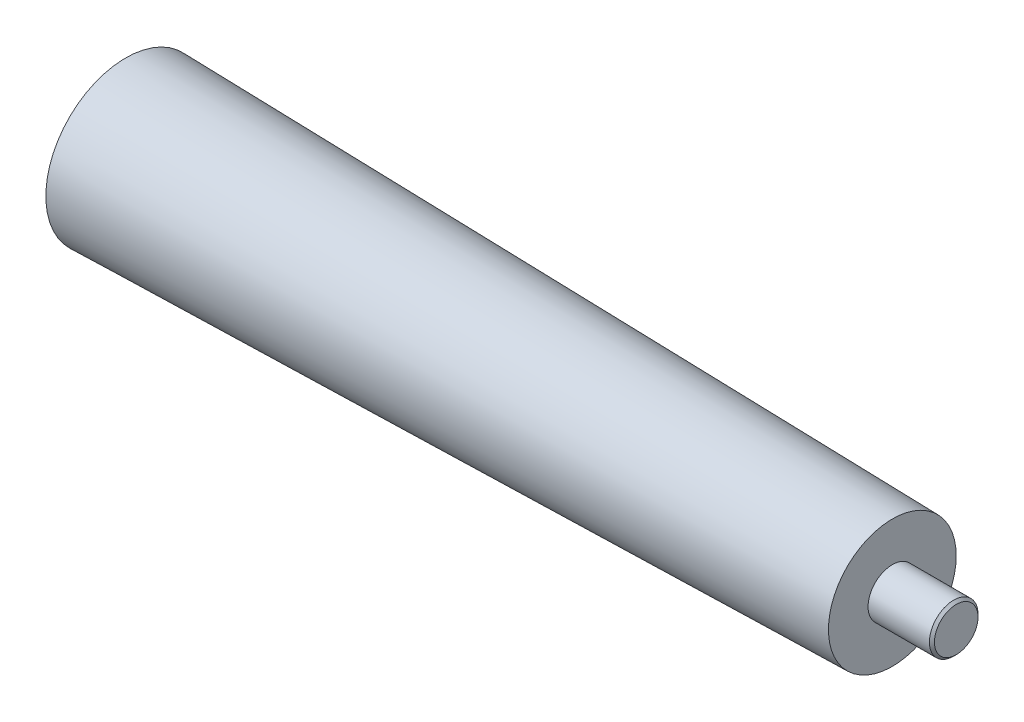
ISO-10303-21;
HEADER;
FILE_DESCRIPTION(('STEP AP214'),'2;1');
FILE_NAME('part.step','',(''),(''),'','','');
FILE_SCHEMA(('AUTOMOTIVE_DESIGN { 1 0 10303 214 1 1 1 1 }'));
ENDSEC;
DATA;
#1=APPLICATION_CONTEXT('core data for automotive mechanical design processes');
#2=APPLICATION_PROTOCOL_DEFINITION('international standard','automotive_design',2000,#1);
#3=PRODUCT_CONTEXT('',#1,'mechanical');
#4=PRODUCT('Part','Part','',(#3));
#5=PRODUCT_RELATED_PRODUCT_CATEGORY('part','',(#4));
#6=PRODUCT_DEFINITION_FORMATION('','',#4);
#7=PRODUCT_DEFINITION_CONTEXT('part definition',#1,'design');
#8=PRODUCT_DEFINITION('design','',#6,#7);
#9=PRODUCT_DEFINITION_SHAPE('','',#8);
#10=(LENGTH_UNIT() NAMED_UNIT(*) SI_UNIT(.MILLI.,.METRE.));
#11=(NAMED_UNIT(*) PLANE_ANGLE_UNIT() SI_UNIT($,.RADIAN.));
#12=(NAMED_UNIT(*) SI_UNIT($,.STERADIAN.) SOLID_ANGLE_UNIT());
#13=UNCERTAINTY_MEASURE_WITH_UNIT(LENGTH_MEASURE(1.E-05),#10,'distance_accuracy_value','');
#14=(GEOMETRIC_REPRESENTATION_CONTEXT(3) GLOBAL_UNCERTAINTY_ASSIGNED_CONTEXT((#13)) GLOBAL_UNIT_ASSIGNED_CONTEXT((#10,
#11,#12)) REPRESENTATION_CONTEXT('',''));
#15=CARTESIAN_POINT('',(0.,0.,0.));
#16=DIRECTION('',(0.,0.,1.));
#17=DIRECTION('',(1.,0.,0.));
#18=AXIS2_PLACEMENT_3D('',#15,#16,#17);
#19=CARTESIAN_POINT('',(-82.55,0.,0.));
#20=DIRECTION('',(-1.,0.,0.));
#21=DIRECTION('',(0.,0.,1.));
#22=AXIS2_PLACEMENT_3D('',#19,#20,#21);
#23=PLANE('',#22);
#24=CARTESIAN_POINT('',(-82.55,0.,0.));
#25=DIRECTION('',(1.,0.,0.));
#26=DIRECTION('',(0.,0.,-1.));
#27=AXIS2_PLACEMENT_3D('',#24,#25,#26);
#28=CIRCLE('',#27,15.88);
#29=CARTESIAN_POINT('',(-82.55,0.,-15.88));
#30=VERTEX_POINT('',#29);
#31=EDGE_CURVE('E10',#30,#30,#28,.T.);
#32=ORIENTED_EDGE('',*,*,#31,.F.);
#33=EDGE_LOOP('',(#32));
#34=FACE_BOUND('',#33,.T.);
#35=ADVANCED_FACE('F31',(#34),#23,.T.);
#36=CARTESIAN_POINT('',(69.85,0.,0.));
#37=DIRECTION('',(-1.,0.,0.));
#38=DIRECTION('',(0.,0.,1.));
#39=AXIS2_PLACEMENT_3D('',#36,#37,#38);
#40=CONICAL_SURFACE('',#39,12.7,0.0208631141791713);
#41=ORIENTED_EDGE('',*,*,#31,.T.);
#42=EDGE_LOOP('',(#41));
#43=FACE_BOUND('',#42,.T.);
#44=CARTESIAN_POINT('',(69.85,0.,0.));
#45=DIRECTION('',(1.,0.,0.));
#46=DIRECTION('',(0.,0.,-1.));
#47=AXIS2_PLACEMENT_3D('',#44,#45,#46);
#48=CIRCLE('',#47,12.7);
#49=CARTESIAN_POINT('',(69.85,0.,-12.7));
#50=VERTEX_POINT('',#49);
#51=EDGE_CURVE('E37',#50,#50,#48,.T.);
#52=ORIENTED_EDGE('',*,*,#51,.F.);
#53=EDGE_LOOP('',(#52));
#54=FACE_BOUND('',#53,.T.);
#55=ADVANCED_FACE('F70',(#43,#54),#40,.T.);
#56=CARTESIAN_POINT('',(69.85,12.7,0.));
#57=DIRECTION('',(1.,0.,0.));
#58=DIRECTION('',(0.,0.,-1.));
#59=AXIS2_PLACEMENT_3D('',#56,#57,#58);
#60=PLANE('',#59);
#61=ORIENTED_EDGE('',*,*,#51,.T.);
#62=EDGE_LOOP('',(#61));
#63=FACE_BOUND('',#62,.T.);
#64=CARTESIAN_POINT('',(69.85,0.,0.));
#65=DIRECTION('',(1.,0.,0.));
#66=DIRECTION('',(0.,0.,-1.));
#67=AXIS2_PLACEMENT_3D('',#64,#65,#66);
#68=CIRCLE('',#67,4.83);
#69=CARTESIAN_POINT('',(69.85,0.,-4.83));
#70=VERTEX_POINT('',#69);
#71=EDGE_CURVE('E41',#70,#70,#68,.T.);
#72=ORIENTED_EDGE('',*,*,#71,.F.);
#73=EDGE_LOOP('',(#72));
#74=FACE_BOUND('',#73,.T.);
#75=ADVANCED_FACE('F66',(#63,#74),#60,.T.);
#76=CARTESIAN_POINT('',(82.55,0.,0.));
#77=DIRECTION('',(1.,0.,0.));
#78=DIRECTION('',(0.,0.,-1.));
#79=AXIS2_PLACEMENT_3D('',#76,#77,#78);
#80=CYLINDRICAL_SURFACE('',#79,4.83);
#81=ORIENTED_EDGE('',*,*,#71,.T.);
#82=EDGE_LOOP('',(#81));
#83=FACE_BOUND('',#82,.T.);
#84=CARTESIAN_POINT('',(82.05,0.,0.));
#85=DIRECTION('',(1.,0.,0.));
#86=DIRECTION('',(0.,0.,-1.));
#87=AXIS2_PLACEMENT_3D('',#84,#85,#86);
#88=CIRCLE('',#87,4.83);
#89=CARTESIAN_POINT('',(82.05,0.,-4.83));
#90=VERTEX_POINT('',#89);
#91=EDGE_CURVE('E45',#90,#90,#88,.T.);
#92=ORIENTED_EDGE('',*,*,#91,.F.);
#93=EDGE_LOOP('',(#92));
#94=FACE_BOUND('',#93,.T.);
#95=ADVANCED_FACE('F58',(#83,#94),#80,.T.);
#96=CARTESIAN_POINT('',(82.55,0.,0.));
#97=DIRECTION('',(-1.,0.,0.));
#98=DIRECTION('',(0.,0.,1.));
#99=AXIS2_PLACEMENT_3D('',#96,#97,#98);
#100=CONICAL_SURFACE('',#99,4.33,0.785398163397447);
#101=ORIENTED_EDGE('',*,*,#91,.T.);
#102=EDGE_LOOP('',(#101));
#103=FACE_BOUND('',#102,.T.);
#104=CARTESIAN_POINT('',(82.55,0.,0.));
#105=DIRECTION('',(1.,0.,0.));
#106=DIRECTION('',(0.,0.,-1.));
#107=AXIS2_PLACEMENT_3D('',#104,#105,#106);
#108=CIRCLE('',#107,4.33);
#109=CARTESIAN_POINT('',(82.55,0.,-4.33));
#110=VERTEX_POINT('',#109);
#111=EDGE_CURVE('E50',#110,#110,#108,.T.);
#112=ORIENTED_EDGE('',*,*,#111,.F.);
#113=EDGE_LOOP('',(#112));
#114=FACE_BOUND('',#113,.T.);
#115=ADVANCED_FACE('F56',(#103,#114),#100,.T.);
#116=CARTESIAN_POINT('',(82.55,4.32999999999998,0.));
#117=DIRECTION('',(1.,0.,0.));
#118=DIRECTION('',(0.,0.,-1.));
#119=AXIS2_PLACEMENT_3D('',#116,#117,#118);
#120=PLANE('',#119);
#121=ORIENTED_EDGE('',*,*,#111,.T.);
#122=EDGE_LOOP('',(#121));
#123=FACE_BOUND('',#122,.T.);
#124=ADVANCED_FACE('F54',(#123),#120,.T.);
#125=CLOSED_SHELL('',(#35,#55,#75,#95,#115,#124));
#126=MANIFOLD_SOLID_BREP('B2',#125);
#127=ADVANCED_BREP_SHAPE_REPRESENTATION('',(#18,#126),#14);
#128=SHAPE_DEFINITION_REPRESENTATION(#9,#127);
ENDSEC;
END-ISO-10303-21;
